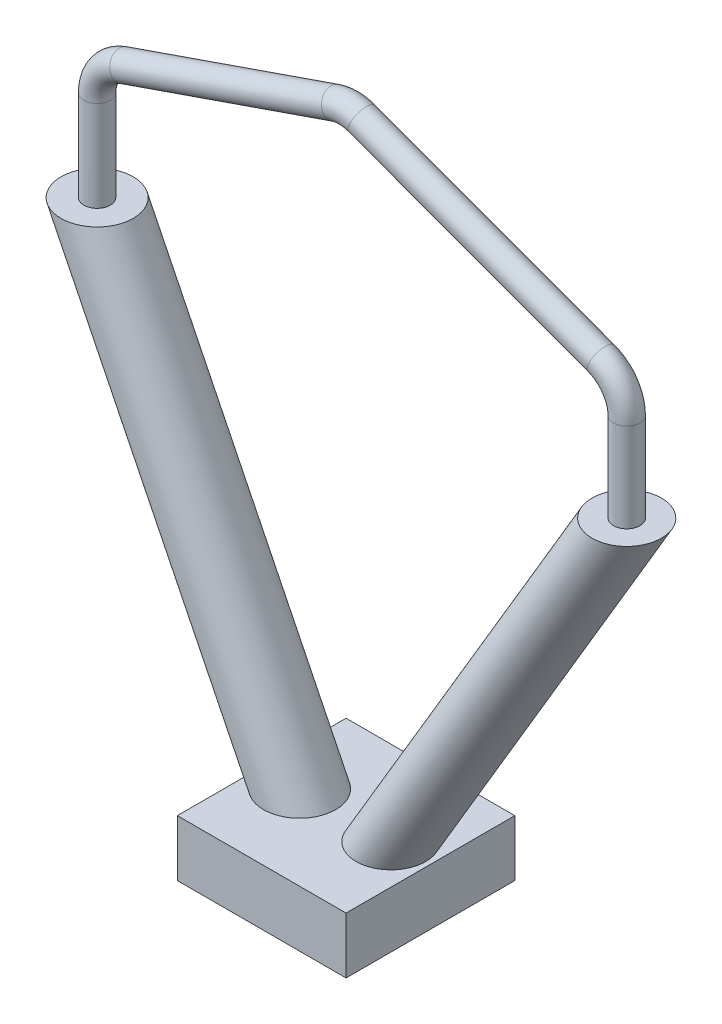
ISO-10303-21;
HEADER;
FILE_DESCRIPTION(('STEP AP214'),'2;1');
FILE_NAME('part.step','',(''),(''),'','','');
FILE_SCHEMA(('AUTOMOTIVE_DESIGN { 1 0 10303 214 1 1 1 1 }'));
ENDSEC;
DATA;
#1=APPLICATION_CONTEXT('core data for automotive mechanical design processes');
#2=APPLICATION_PROTOCOL_DEFINITION('international standard','automotive_design',2000,#1);
#3=PRODUCT_CONTEXT('',#1,'mechanical');
#4=PRODUCT('Part','Part','',(#3));
#5=PRODUCT_RELATED_PRODUCT_CATEGORY('part','',(#4));
#6=PRODUCT_DEFINITION_FORMATION('','',#4);
#7=PRODUCT_DEFINITION_CONTEXT('part definition',#1,'design');
#8=PRODUCT_DEFINITION('design','',#6,#7);
#9=PRODUCT_DEFINITION_SHAPE('','',#8);
#10=(LENGTH_UNIT() NAMED_UNIT(*) SI_UNIT(.MILLI.,.METRE.));
#11=(NAMED_UNIT(*) PLANE_ANGLE_UNIT() SI_UNIT($,.RADIAN.));
#12=(NAMED_UNIT(*) SI_UNIT($,.STERADIAN.) SOLID_ANGLE_UNIT());
#13=UNCERTAINTY_MEASURE_WITH_UNIT(LENGTH_MEASURE(1.E-05),#10,'distance_accuracy_value','');
#14=(GEOMETRIC_REPRESENTATION_CONTEXT(3) GLOBAL_UNCERTAINTY_ASSIGNED_CONTEXT((#13)) GLOBAL_UNIT_ASSIGNED_CONTEXT((#10,
#11,#12)) REPRESENTATION_CONTEXT('',''));
#15=CARTESIAN_POINT('',(0.,0.,0.));
#16=DIRECTION('',(0.,0.,1.));
#17=DIRECTION('',(1.,0.,0.));
#18=AXIS2_PLACEMENT_3D('',#15,#16,#17);
#19=CARTESIAN_POINT('',(150.,100.,-150.));
#20=DIRECTION('',(-1.,0.,0.));
#21=DIRECTION('',(0.,0.,1.));
#22=AXIS2_PLACEMENT_3D('',#19,#20,#21);
#23=PLANE('',#22);
#24=DIRECTION('',(0.,0.,-1.));
#25=VECTOR('',#24,1.);
#26=CARTESIAN_POINT('',(150.,0.,-150.));
#27=LINE('',#26,#25);
#28=CARTESIAN_POINT('',(150.,0.,150.));
#29=VERTEX_POINT('',#28);
#30=CARTESIAN_POINT('',(150.,0.,-150.));
#31=VERTEX_POINT('',#30);
#32=EDGE_CURVE('E95',#29,#31,#27,.T.);
#33=ORIENTED_EDGE('',*,*,#32,.T.);
#34=DIRECTION('',(0.,-1.,0.));
#35=VECTOR('',#34,1.);
#36=CARTESIAN_POINT('',(150.,100.,-150.));
#37=LINE('',#36,#35);
#38=CARTESIAN_POINT('',(150.,100.,-150.));
#39=VERTEX_POINT('',#38);
#40=EDGE_CURVE('E120',#39,#31,#37,.T.);
#41=ORIENTED_EDGE('',*,*,#40,.F.);
#42=DIRECTION('',(0.,0.,-1.));
#43=VECTOR('',#42,1.);
#44=CARTESIAN_POINT('',(150.,100.,-150.));
#45=LINE('',#44,#43);
#46=CARTESIAN_POINT('',(150.,100.,150.));
#47=VERTEX_POINT('',#46);
#48=EDGE_CURVE('E102',#47,#39,#45,.T.);
#49=ORIENTED_EDGE('',*,*,#48,.F.);
#50=DIRECTION('',(0.,-1.,0.));
#51=VECTOR('',#50,1.);
#52=CARTESIAN_POINT('',(150.,100.,150.));
#53=LINE('',#52,#51);
#54=EDGE_CURVE('E108',#47,#29,#53,.T.);
#55=ORIENTED_EDGE('',*,*,#54,.T.);
#56=EDGE_LOOP('',(#33,#41,#49,#55));
#57=FACE_BOUND('',#56,.T.);
#58=ADVANCED_FACE('F32',(#57),#23,.F.);
#59=CARTESIAN_POINT('',(-150.,100.,-150.));
#60=DIRECTION('',(0.,0.,1.));
#61=DIRECTION('',(1.,0.,0.));
#62=AXIS2_PLACEMENT_3D('',#59,#60,#61);
#63=PLANE('',#62);
#64=DIRECTION('',(-1.,0.,0.));
#65=VECTOR('',#64,1.);
#66=CARTESIAN_POINT('',(-150.,0.,-150.));
#67=LINE('',#66,#65);
#68=CARTESIAN_POINT('',(-150.,0.,-150.));
#69=VERTEX_POINT('',#68);
#70=EDGE_CURVE('E111',#31,#69,#67,.T.);
#71=ORIENTED_EDGE('',*,*,#70,.T.);
#72=DIRECTION('',(0.,-1.,0.));
#73=VECTOR('',#72,1.);
#74=CARTESIAN_POINT('',(-150.,100.,-150.));
#75=LINE('',#74,#73);
#76=CARTESIAN_POINT('',(-150.,100.,-150.));
#77=VERTEX_POINT('',#76);
#78=EDGE_CURVE('E118',#77,#69,#75,.T.);
#79=ORIENTED_EDGE('',*,*,#78,.F.);
#80=DIRECTION('',(-1.,0.,0.));
#81=VECTOR('',#80,1.);
#82=CARTESIAN_POINT('',(-150.,100.,-150.));
#83=LINE('',#82,#81);
#84=EDGE_CURVE('E81',#39,#77,#83,.T.);
#85=ORIENTED_EDGE('',*,*,#84,.F.);
#86=ORIENTED_EDGE('',*,*,#40,.T.);
#87=EDGE_LOOP('',(#71,#79,#85,#86));
#88=FACE_BOUND('',#87,.T.);
#89=ADVANCED_FACE('F140',(#88),#63,.F.);
#90=CARTESIAN_POINT('',(-150.,100.,-150.));
#91=DIRECTION('',(1.,0.,0.));
#92=DIRECTION('',(0.,0.,-1.));
#93=AXIS2_PLACEMENT_3D('',#90,#91,#92);
#94=PLANE('',#93);
#95=DIRECTION('',(0.,0.,1.));
#96=VECTOR('',#95,1.);
#97=CARTESIAN_POINT('',(-150.,0.,-150.));
#98=LINE('',#97,#96);
#99=CARTESIAN_POINT('',(-150.,0.,150.));
#100=VERTEX_POINT('',#99);
#101=EDGE_CURVE('E67',#69,#100,#98,.T.);
#102=ORIENTED_EDGE('',*,*,#101,.T.);
#103=DIRECTION('',(0.,-1.,0.));
#104=VECTOR('',#103,1.);
#105=CARTESIAN_POINT('',(-150.,100.,150.));
#106=LINE('',#105,#104);
#107=CARTESIAN_POINT('',(-150.,100.,150.));
#108=VERTEX_POINT('',#107);
#109=EDGE_CURVE('E116',#108,#100,#106,.T.);
#110=ORIENTED_EDGE('',*,*,#109,.F.);
#111=DIRECTION('',(0.,0.,1.));
#112=VECTOR('',#111,1.);
#113=CARTESIAN_POINT('',(-150.,100.,-150.));
#114=LINE('',#113,#112);
#115=EDGE_CURVE('E105',#77,#108,#114,.T.);
#116=ORIENTED_EDGE('',*,*,#115,.F.);
#117=ORIENTED_EDGE('',*,*,#78,.T.);
#118=EDGE_LOOP('',(#102,#110,#116,#117));
#119=FACE_BOUND('',#118,.T.);
#120=ADVANCED_FACE('F143',(#119),#94,.F.);
#121=CARTESIAN_POINT('',(-150.,100.,150.));
#122=DIRECTION('',(0.,0.,-1.));
#123=DIRECTION('',(-1.,0.,0.));
#124=AXIS2_PLACEMENT_3D('',#121,#122,#123);
#125=PLANE('',#124);
#126=DIRECTION('',(1.,0.,0.));
#127=VECTOR('',#126,1.);
#128=CARTESIAN_POINT('',(-150.,0.,150.));
#129=LINE('',#128,#127);
#130=EDGE_CURVE('E73',#100,#29,#129,.T.);
#131=ORIENTED_EDGE('',*,*,#130,.T.);
#132=ORIENTED_EDGE('',*,*,#54,.F.);
#133=DIRECTION('',(1.,0.,0.));
#134=VECTOR('',#133,1.);
#135=CARTESIAN_POINT('',(-150.,100.,150.));
#136=LINE('',#135,#134);
#137=EDGE_CURVE('E49',#108,#47,#136,.T.);
#138=ORIENTED_EDGE('',*,*,#137,.F.);
#139=ORIENTED_EDGE('',*,*,#109,.T.);
#140=EDGE_LOOP('',(#131,#132,#138,#139));
#141=FACE_BOUND('',#140,.T.);
#142=ADVANCED_FACE('F134',(#141),#125,.F.);
#143=CARTESIAN_POINT('',(0.,100.,0.));
#144=DIRECTION('',(0.,1.,0.));
#145=DIRECTION('',(0.,0.,1.));
#146=AXIS2_PLACEMENT_3D('',#143,#144,#145);
#147=PLANE('',#146);
#148=CARTESIAN_POINT('',(-82.5763052818377,100.,0.));
#149=DIRECTION('',(0.,1.,0.));
#150=DIRECTION('',(0.,0.,1.));
#151=AXIS2_PLACEMENT_3D('',#148,#149,#150);
#152=CIRCLE('',#151,64.1383141800667);
#153=CARTESIAN_POINT('',(-82.5763052818377,100.,64.1383141800667));
#154=VERTEX_POINT('',#153);
#155=EDGE_CURVE('E35',#154,#154,#152,.T.);
#156=ORIENTED_EDGE('',*,*,#155,.F.);
#157=EDGE_LOOP('',(#156));
#158=FACE_BOUND('',#157,.T.);
#159=CARTESIAN_POINT('',(79.7197196387326,100.,0.));
#160=DIRECTION('',(0.,1.,0.));
#161=DIRECTION('',(0.,0.,1.));
#162=AXIS2_PLACEMENT_3D('',#159,#160,#161);
#163=CIRCLE('',#162,61.7577937173229);
#164=CARTESIAN_POINT('',(79.7197196387326,100.,61.7577937173229));
#165=VERTEX_POINT('',#164);
#166=EDGE_CURVE('E121',#165,#165,#163,.T.);
#167=ORIENTED_EDGE('',*,*,#166,.F.);
#168=EDGE_LOOP('',(#167));
#169=FACE_BOUND('',#168,.T.);
#170=ORIENTED_EDGE('',*,*,#48,.T.);
#171=ORIENTED_EDGE('',*,*,#84,.T.);
#172=ORIENTED_EDGE('',*,*,#115,.T.);
#173=ORIENTED_EDGE('',*,*,#137,.T.);
#174=EDGE_LOOP('',(#170,#171,#172,#173));
#175=FACE_BOUND('',#174,.T.);
#176=ADVANCED_FACE('F130',(#158,#169,#175),#147,.T.);
#177=CARTESIAN_POINT('',(0.,0.,0.));
#178=DIRECTION('',(0.,1.,0.));
#179=DIRECTION('',(0.,0.,1.));
#180=AXIS2_PLACEMENT_3D('',#177,#178,#179);
#181=PLANE('',#180);
#182=ORIENTED_EDGE('',*,*,#32,.F.);
#183=ORIENTED_EDGE('',*,*,#130,.F.);
#184=ORIENTED_EDGE('',*,*,#101,.F.);
#185=ORIENTED_EDGE('',*,*,#70,.F.);
#186=EDGE_LOOP('',(#182,#183,#184,#185));
#187=FACE_BOUND('',#186,.T.);
#188=ADVANCED_FACE('F133',(#187),#181,.F.);
#189=CARTESIAN_POINT('',(499.0174425543,807.657749642575,2.18473481928987E-12));
#190=DIRECTION('',(0.,1.,0.));
#191=DIRECTION('',(0.,0.,1.));
#192=AXIS2_PLACEMENT_3D('',#189,#190,#191);
#193=PLANE('',#192);
#194=CARTESIAN_POINT('',(499.0174425543,807.657749642575,2.18473481928987E-12));
#195=DIRECTION('',(0.,1.,0.));
#196=DIRECTION('',(0.,0.,1.));
#197=AXIS2_PLACEMENT_3D('',#194,#195,#196);
#198=CIRCLE('',#197,23.4986262950645);
#199=CARTESIAN_POINT('',(499.0174425543,807.657749642575,23.4986262950667));
#200=VERTEX_POINT('',#199);
#201=EDGE_CURVE('E11',#200,#200,#198,.T.);
#202=ORIENTED_EDGE('',*,*,#201,.F.);
#203=EDGE_LOOP('',(#202));
#204=FACE_BOUND('',#203,.T.);
#205=CARTESIAN_POINT('',(499.0174425543,807.657749642575,2.18473481928987E-12));
#206=DIRECTION('',(0.,1.,0.));
#207=DIRECTION('',(0.,0.,1.));
#208=AXIS2_PLACEMENT_3D('',#205,#206,#207);
#209=CIRCLE('',#208,61.7577937173229);
#210=CARTESIAN_POINT('',(499.0174425543,807.657749642575,61.7577937173251));
#211=VERTEX_POINT('',#210);
#212=EDGE_CURVE('E92',#211,#211,#209,.T.);
#213=ORIENTED_EDGE('',*,*,#212,.T.);
#214=EDGE_LOOP('',(#213));
#215=FACE_BOUND('',#214,.T.);
#216=ADVANCED_FACE('F145',(#204,#215),#193,.T.);
#217=CARTESIAN_POINT('',(79.7197196387326,100.,61.7577937173229));
#218=CARTESIAN_POINT('',(499.0174425543,807.657749642575,61.7577937173251));
#219=CARTESIAN_POINT('',(203.235307073378,100.,61.7577937173229));
#220=CARTESIAN_POINT('',(622.533029988946,807.657749642575,61.7577937173251));
#221=CARTESIAN_POINT('',(203.235307073378,100.,-61.7577937173229));
#222=CARTESIAN_POINT('',(622.533029988946,807.657749642575,-61.7577937173207));
#223=CARTESIAN_POINT('',(79.7197196387326,100.,-61.7577937173229));
#224=CARTESIAN_POINT('',(499.0174425543,807.657749642575,-61.7577937173207));
#225=CARTESIAN_POINT('',(-43.7958677959131,100.,-61.7577937173229));
#226=CARTESIAN_POINT('',(375.501855119654,807.657749642575,-61.7577937173207));
#227=CARTESIAN_POINT('',(-43.7958677959131,100.,61.7577937173229));
#228=CARTESIAN_POINT('',(375.501855119654,807.657749642575,61.7577937173251));
#229=CARTESIAN_POINT('',(79.7197196387326,100.,61.7577937173229));
#230=CARTESIAN_POINT('',(499.0174425543,807.657749642575,61.7577937173251));
#231=(BOUNDED_SURFACE() B_SPLINE_SURFACE(3,1,((#217,#218),(#219,#220),(#221,#222),(#223,#224),
(#225,#226),(#227,#228),(#229,#230)),.UNSPECIFIED.,.T.,.F.,.F.) B_SPLINE_SURFACE_WITH_KNOTS((4,
3,4),(2,2),(0.,0.5,1.),(0.,1.),
.UNSPECIFIED.) GEOMETRIC_REPRESENTATION_ITEM() RATIONAL_B_SPLINE_SURFACE(((1.,1.),
(0.333333333333333,0.333333333333333),(0.333333333333333,0.333333333333333),(1.,1.),
(0.333333333333333,0.333333333333333),(0.333333333333333,0.333333333333333),(1.,1.))) REPRESENTATION_ITEM('') SURFACE());
#232=ORIENTED_EDGE('',*,*,#212,.F.);
#233=EDGE_LOOP('',(#232));
#234=FACE_BOUND('',#233,.T.);
#235=ORIENTED_EDGE('',*,*,#166,.T.);
#236=EDGE_LOOP('',(#235));
#237=FACE_BOUND('',#236,.T.);
#238=ADVANCED_FACE('F147',(#234,#237),#231,.T.);
#239=CARTESIAN_POINT('',(-442.652634805131,830.366298789155,2.31353072319635E-12));
#240=DIRECTION('',(0.,1.,0.));
#241=DIRECTION('',(0.,0.,1.));
#242=AXIS2_PLACEMENT_3D('',#239,#240,#241);
#243=PLANE('',#242);
#244=CARTESIAN_POINT('',(-442.652634805131,830.366298789155,2.31353072319635E-12));
#245=DIRECTION('',(0.,-1.,0.));
#246=DIRECTION('',(0.,0.,1.));
#247=AXIS2_PLACEMENT_3D('',#244,#245,#246);
#248=CIRCLE('',#247,23.4986262950645);
#249=CARTESIAN_POINT('',(-442.652634805131,830.366298789156,23.4986262950668));
#250=VERTEX_POINT('',#249);
#251=EDGE_CURVE('E93',#250,#250,#248,.T.);
#252=ORIENTED_EDGE('',*,*,#251,.T.);
#253=EDGE_LOOP('',(#252));
#254=FACE_BOUND('',#253,.T.);
#255=CARTESIAN_POINT('',(-442.652634805131,830.366298789155,2.31353072319635E-12));
#256=DIRECTION('',(0.,1.,0.));
#257=DIRECTION('',(0.,0.,1.));
#258=AXIS2_PLACEMENT_3D('',#255,#256,#257);
#259=CIRCLE('',#258,64.1383141800667);
#260=CARTESIAN_POINT('',(-442.652634805131,830.366298789155,64.138314180069));
#261=VERTEX_POINT('',#260);
#262=EDGE_CURVE('E89',#261,#261,#259,.T.);
#263=ORIENTED_EDGE('',*,*,#262,.T.);
#264=EDGE_LOOP('',(#263));
#265=FACE_BOUND('',#264,.T.);
#266=ADVANCED_FACE('F90',(#254,#265),#243,.T.);
#267=CARTESIAN_POINT('',(-82.5763052818377,100.,64.1383141800667));
#268=CARTESIAN_POINT('',(-442.652634805131,830.366298789155,64.138314180069));
#269=CARTESIAN_POINT('',(45.7003230782957,100.,64.1383141800667));
#270=CARTESIAN_POINT('',(-314.376006444998,830.366298789155,64.138314180069));
#271=CARTESIAN_POINT('',(45.7003230782957,100.,-64.1383141800667));
#272=CARTESIAN_POINT('',(-314.376006444998,830.366298789155,-64.1383141800644));
#273=CARTESIAN_POINT('',(-82.5763052818377,100.,-64.1383141800667));
#274=CARTESIAN_POINT('',(-442.652634805131,830.366298789155,-64.1383141800644));
#275=CARTESIAN_POINT('',(-210.852933641971,100.,-64.1383141800667));
#276=CARTESIAN_POINT('',(-570.929263165265,830.366298789155,-64.1383141800644));
#277=CARTESIAN_POINT('',(-210.852933641971,100.,64.1383141800667));
#278=CARTESIAN_POINT('',(-570.929263165265,830.366298789155,64.138314180069));
#279=CARTESIAN_POINT('',(-82.5763052818377,100.,64.1383141800667));
#280=CARTESIAN_POINT('',(-442.652634805131,830.366298789155,64.138314180069));
#281=(BOUNDED_SURFACE() B_SPLINE_SURFACE(3,1,((#267,#268),(#269,#270),(#271,#272),(#273,#274),
(#275,#276),(#277,#278),(#279,#280)),.UNSPECIFIED.,.T.,.F.,.F.) B_SPLINE_SURFACE_WITH_KNOTS((4,
3,4),(2,2),(0.,0.5,1.),(0.,1.),
.UNSPECIFIED.) GEOMETRIC_REPRESENTATION_ITEM() RATIONAL_B_SPLINE_SURFACE(((1.,1.),
(0.333333333333333,0.333333333333333),(0.333333333333333,0.333333333333333),(1.,1.),
(0.333333333333333,0.333333333333333),(0.333333333333333,0.333333333333333),(1.,1.))) REPRESENTATION_ITEM('') SURFACE());
#282=ORIENTED_EDGE('',*,*,#262,.F.);
#283=EDGE_LOOP('',(#282));
#284=FACE_BOUND('',#283,.T.);
#285=ORIENTED_EDGE('',*,*,#155,.T.);
#286=EDGE_LOOP('',(#285));
#287=FACE_BOUND('',#286,.T.);
#288=ADVANCED_FACE('F128',(#284,#287),#281,.T.);
#289=CARTESIAN_POINT('',(499.0174425543,807.657749642575,2.18473481928987E-12));
#290=DIRECTION('',(0.,1.,0.));
#291=DIRECTION('',(0.,0.,1.));
#292=AXIS2_PLACEMENT_3D('',#289,#290,#291);
#293=CYLINDRICAL_SURFACE('',#292,23.4986262950645);
#294=CARTESIAN_POINT('',(499.0174425543,965.743179521314,5.15710336395529E-13));
#295=DIRECTION('',(0.,1.,0.));
#296=DIRECTION('',(0.,0.,1.));
#297=AXIS2_PLACEMENT_3D('',#294,#295,#296);
#298=CIRCLE('',#297,23.4986262950645);
#299=CARTESIAN_POINT('',(522.516068849364,965.743179521314,3.28698720297666E-12));
#300=VERTEX_POINT('',#299);
#301=EDGE_CURVE('E306',#300,#300,#298,.T.);
#302=ORIENTED_EDGE('',*,*,#301,.F.);
#303=EDGE_LOOP('',(#302));
#304=FACE_BOUND('',#303,.T.);
#305=ORIENTED_EDGE('',*,*,#201,.T.);
#306=EDGE_LOOP('',(#305));
#307=FACE_BOUND('',#306,.T.);
#308=ADVANCED_FACE('F187',(#304,#307),#293,.T.);
#309=CARTESIAN_POINT('',(429.0174425543,965.743179521314,-7.73963949660402E-12));
#310=DIRECTION('',(0.,0.,1.));
#311=DIRECTION('',(1.,0.,0.));
#312=AXIS2_PLACEMENT_3D('',#309,#310,#311);
#313=TOROIDAL_SURFACE('',#312,70.,23.4986262950645);
#314=CARTESIAN_POINT('',(453.170648011251,1031.44418914943,7.87399073533711E-13));
#315=DIRECTION('',(-0.938585851830284,0.34504579224216,0.));
#316=DIRECTION('',(0.,0.,1.));
#317=AXIS2_PLACEMENT_3D('',#314,#315,#316);
#318=CIRCLE('',#317,23.4986262950645);
#319=CARTESIAN_POINT('',(461.278750137834,1053.49966732743,3.64988039872324E-12));
#320=VERTEX_POINT('',#319);
#321=EDGE_CURVE('E303',#320,#320,#318,.T.);
#322=CARTESIAN_POINT('',(429.0174425543,965.743179521314,-7.73963949660402E-12));
#323=DIRECTION('',(0.,0.,1.));
#324=DIRECTION('',(1.,0.,0.));
#325=AXIS2_PLACEMENT_3D('',#322,#323,#324);
#326=CIRCLE('',#325,93.4986262950644);
#327=EDGE_CURVE('',#300,#320,#326,.T.);
#328=ORIENTED_EDGE('',*,*,#301,.T.);
#329=ORIENTED_EDGE('',*,*,#321,.F.);
#330=ORIENTED_EDGE('',*,*,#327,.T.);
#331=ORIENTED_EDGE('',*,*,#327,.F.);
#332=EDGE_LOOP('',(#328,#330,#329,#331));
#333=FACE_BOUND('',#332,.T.);
#334=ADVANCED_FACE('F212',(#333),#313,.T.);
#335=CARTESIAN_POINT('',(453.170648011251,1031.44418914943,0.));
#336=DIRECTION('',(-0.938585851830284,0.34504579224216,0.));
#337=DIRECTION('',(-0.34504579224216,-0.938585851830285,0.));
#338=AXIS2_PLACEMENT_3D('',#335,#336,#337);
#339=CYLINDRICAL_SURFACE('',#338,23.4986262950645);
#340=CARTESIAN_POINT('',(27.9929332897321,1187.74931684097,0.));
#341=DIRECTION('',(-0.938585851830284,0.34504579224216,0.));
#342=DIRECTION('',(0.,0.,1.));
#343=AXIS2_PLACEMENT_3D('',#340,#341,#342);
#344=CIRCLE('',#343,23.4986262950645);
#345=CARTESIAN_POINT('',(36.101035416315,1209.80479501896,0.));
#346=VERTEX_POINT('',#345);
#347=EDGE_CURVE('E300',#346,#346,#344,.T.);
#348=ORIENTED_EDGE('',*,*,#347,.F.);
#349=EDGE_LOOP('',(#348));
#350=FACE_BOUND('',#349,.T.);
#351=ORIENTED_EDGE('',*,*,#321,.T.);
#352=EDGE_LOOP('',(#351));
#353=FACE_BOUND('',#352,.T.);
#354=ADVANCED_FACE('F222',(#350,#353),#339,.T.);
#355=CARTESIAN_POINT('',(3.83972783278103,1122.04830721285,0.));
#356=DIRECTION('',(0.,0.,1.));
#357=DIRECTION('',(1.,0.,0.));
#358=AXIS2_PLACEMENT_3D('',#355,#356,#357);
#359=TOROIDAL_SURFACE('',#358,70.,23.4986262950645);
#360=CARTESIAN_POINT('',(-19.0540602204565,1188.19870002025,0.));
#361=DIRECTION('',(-0.945005611534299,-0.32705411504625,0.));
#362=DIRECTION('',(0.,0.,1.));
#363=AXIS2_PLACEMENT_3D('',#360,#361,#362);
#364=CIRCLE('',#363,23.4986262950645);
#365=CARTESIAN_POINT('',(-26.7393826481913,1210.40503373243,0.));
#366=VERTEX_POINT('',#365);
#367=EDGE_CURVE('E295',#366,#366,#364,.T.);
#368=CARTESIAN_POINT('',(3.83972783278103,1122.04830721285,0.));
#369=DIRECTION('',(0.,0.,1.));
#370=DIRECTION('',(1.,0.,0.));
#371=AXIS2_PLACEMENT_3D('',#368,#369,#370);
#372=CIRCLE('',#371,93.4986262950644);
#373=EDGE_CURVE('',#346,#366,#372,.T.);
#374=ORIENTED_EDGE('',*,*,#347,.T.);
#375=ORIENTED_EDGE('',*,*,#367,.F.);
#376=ORIENTED_EDGE('',*,*,#373,.T.);
#377=ORIENTED_EDGE('',*,*,#373,.F.);
#378=EDGE_LOOP('',(#374,#376,#375,#377));
#379=FACE_BOUND('',#378,.T.);
#380=ADVANCED_FACE('F232',(#379),#359,.T.);
#381=CARTESIAN_POINT('',(-19.0540602204565,1188.19870002025,0.));
#382=DIRECTION('',(-0.945005611534299,-0.327054115046249,0.));
#383=DIRECTION('',(0.327054115046249,-0.945005611534299,0.));
#384=AXIS2_PLACEMENT_3D('',#381,#382,#383);
#385=CYLINDRICAL_SURFACE('',#384,23.4986262950645);
#386=CARTESIAN_POINT('',(-395.546422858369,1057.89960445795,0.));
#387=DIRECTION('',(-0.945005611534299,-0.327054115046249,0.));
#388=DIRECTION('',(0.,0.,1.));
#389=AXIS2_PLACEMENT_3D('',#386,#387,#388);
#390=CIRCLE('',#389,23.4986262950645);
#391=CARTESIAN_POINT('',(-403.231745286103,1080.10593817013,-2.72349644818409E-13));
#392=VERTEX_POINT('',#391);
#393=EDGE_CURVE('E293',#392,#392,#390,.T.);
#394=ORIENTED_EDGE('',*,*,#393,.F.);
#395=EDGE_LOOP('',(#394));
#396=FACE_BOUND('',#395,.T.);
#397=ORIENTED_EDGE('',*,*,#367,.T.);
#398=EDGE_LOOP('',(#397));
#399=FACE_BOUND('',#398,.T.);
#400=ADVANCED_FACE('F242',(#396,#399),#385,.T.);
#401=CARTESIAN_POINT('',(-372.652634805131,991.74921165055,8.11301686230604E-13));
#402=DIRECTION('',(0.,0.,1.));
#403=DIRECTION('',(1.,0.,0.));
#404=AXIS2_PLACEMENT_3D('',#401,#402,#403);
#405=TOROIDAL_SURFACE('',#404,70.,23.4986262950645);
#406=CARTESIAN_POINT('',(-442.652634805131,991.74921165055,8.11301686230604E-13));
#407=DIRECTION('',(0.,-1.,0.));
#408=DIRECTION('',(0.,0.,1.));
#409=AXIS2_PLACEMENT_3D('',#406,#407,#408);
#410=CIRCLE('',#409,23.4986262950645);
#411=CARTESIAN_POINT('',(-466.151261100196,991.74921165055,8.11301686230604E-13));
#412=VERTEX_POINT('',#411);
#413=EDGE_CURVE('E98',#412,#412,#410,.T.);
#414=CARTESIAN_POINT('',(-372.652634805131,991.74921165055,8.11301686230604E-13));
#415=DIRECTION('',(0.,0.,1.));
#416=DIRECTION('',(1.,0.,0.));
#417=AXIS2_PLACEMENT_3D('',#414,#415,#416);
#418=CIRCLE('',#417,93.4986262950645);
#419=EDGE_CURVE('',#392,#412,#418,.T.);
#420=ORIENTED_EDGE('',*,*,#393,.T.);
#421=ORIENTED_EDGE('',*,*,#413,.F.);
#422=ORIENTED_EDGE('',*,*,#419,.T.);
#423=ORIENTED_EDGE('',*,*,#419,.F.);
#424=EDGE_LOOP('',(#420,#422,#421,#423));
#425=FACE_BOUND('',#424,.T.);
#426=ADVANCED_FACE('F252',(#425),#405,.T.);
#427=CARTESIAN_POINT('',(-442.652634805131,991.74921165055,5.45962131204923E-13));
#428=DIRECTION('',(0.,-1.,0.));
#429=DIRECTION('',(0.,0.,-1.));
#430=AXIS2_PLACEMENT_3D('',#427,#428,#429);
#431=CYLINDRICAL_SURFACE('',#430,23.4986262950645);
#432=ORIENTED_EDGE('',*,*,#251,.F.);
#433=EDGE_LOOP('',(#432));
#434=FACE_BOUND('',#433,.T.);
#435=ORIENTED_EDGE('',*,*,#413,.T.);
#436=EDGE_LOOP('',(#435));
#437=FACE_BOUND('',#436,.T.);
#438=ADVANCED_FACE('F206',(#434,#437),#431,.T.);
#439=CLOSED_SHELL('',(#58,#89,#120,#142,#176,#188,#216,#238,#266,#288,#308,#334,#354,#380,#400,
#426,#438));
#440=MANIFOLD_SOLID_BREP('B2',#439);
#441=ADVANCED_BREP_SHAPE_REPRESENTATION('',(#18,#440),#14);
#442=SHAPE_DEFINITION_REPRESENTATION(#9,#441);
ENDSEC;
END-ISO-10303-21;
